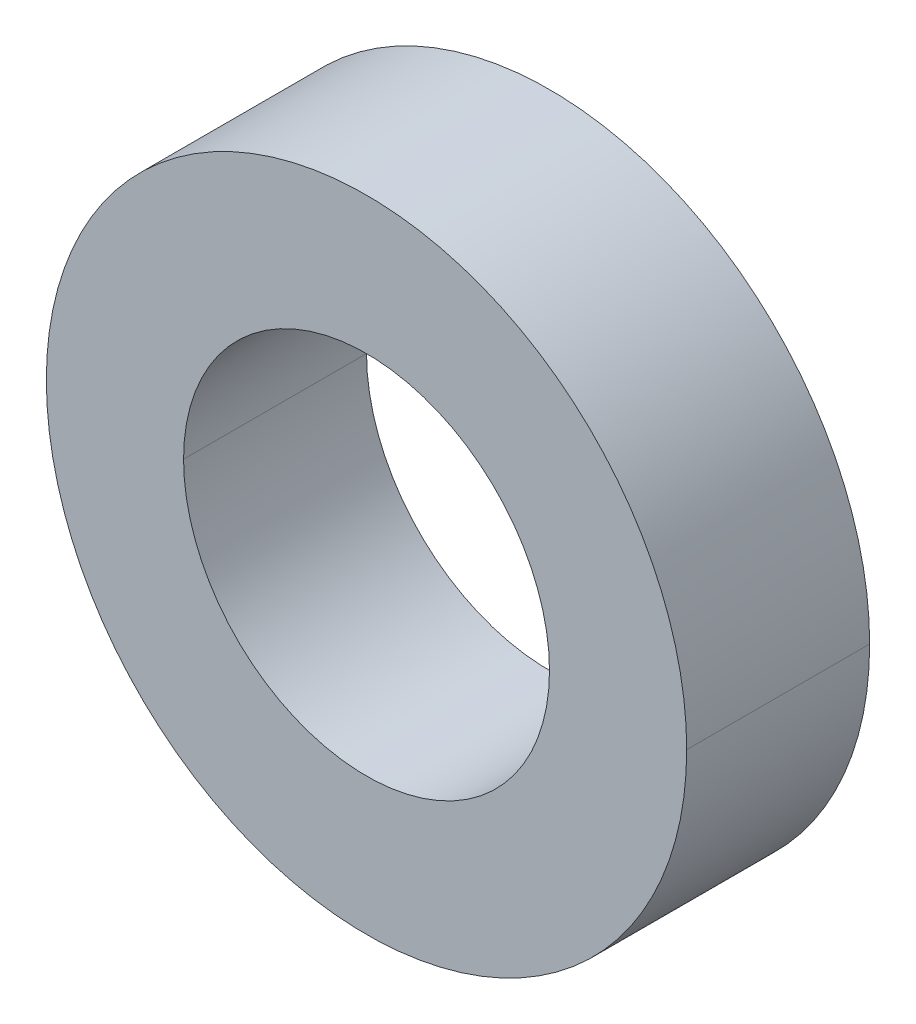
ISO-10303-21;
HEADER;
FILE_DESCRIPTION(('STEP AP214'),'2;1');
FILE_NAME('part.step','',(''),(''),'','','');
FILE_SCHEMA(('AUTOMOTIVE_DESIGN { 1 0 10303 214 1 1 1 1 }'));
ENDSEC;
DATA;
#1=APPLICATION_CONTEXT('core data for automotive mechanical design processes');
#2=APPLICATION_PROTOCOL_DEFINITION('international standard','automotive_design',2000,#1);
#3=PRODUCT_CONTEXT('',#1,'mechanical');
#4=PRODUCT('Part','Part','',(#3));
#5=PRODUCT_RELATED_PRODUCT_CATEGORY('part','',(#4));
#6=PRODUCT_DEFINITION_FORMATION('','',#4);
#7=PRODUCT_DEFINITION_CONTEXT('part definition',#1,'design');
#8=PRODUCT_DEFINITION('design','',#6,#7);
#9=PRODUCT_DEFINITION_SHAPE('','',#8);
#10=(LENGTH_UNIT() NAMED_UNIT(*) SI_UNIT(.MILLI.,.METRE.));
#11=(NAMED_UNIT(*) PLANE_ANGLE_UNIT() SI_UNIT($,.RADIAN.));
#12=(NAMED_UNIT(*) SI_UNIT($,.STERADIAN.) SOLID_ANGLE_UNIT());
#13=UNCERTAINTY_MEASURE_WITH_UNIT(LENGTH_MEASURE(1.E-05),#10,'distance_accuracy_value','');
#14=(GEOMETRIC_REPRESENTATION_CONTEXT(3) GLOBAL_UNCERTAINTY_ASSIGNED_CONTEXT((#13)) GLOBAL_UNIT_ASSIGNED_CONTEXT((#10,
#11,#12)) REPRESENTATION_CONTEXT('',''));
#15=CARTESIAN_POINT('',(0.,0.,0.));
#16=DIRECTION('',(0.,0.,1.));
#17=DIRECTION('',(1.,0.,0.));
#18=AXIS2_PLACEMENT_3D('',#15,#16,#17);
#19=CARTESIAN_POINT('',(0.403421843265389,-40.0666634220304,10.));
#20=DIRECTION('',(0.,0.,-1.));
#21=DIRECTION('',(-1.,0.,0.));
#22=AXIS2_PLACEMENT_3D('',#19,#20,#21);
#23=CYLINDRICAL_SURFACE('',#22,10.);
#24=DIRECTION('',(0.,0.,-1.));
#25=VECTOR('',#24,1.);
#26=CARTESIAN_POINT('',(10.4034218432654,-40.0666634220304,10.));
#27=LINE('',#26,#25);
#28=CARTESIAN_POINT('',(10.4034218432654,-40.0666634220304,10.));
#29=VERTEX_POINT('',#28);
#30=CARTESIAN_POINT('',(10.4034218432654,-40.0666634220304,0.));
#31=VERTEX_POINT('',#30);
#32=EDGE_CURVE('E75',#29,#31,#27,.T.);
#33=ORIENTED_EDGE('',*,*,#32,.F.);
#34=CARTESIAN_POINT('',(0.403421843265389,-40.0666634220304,10.));
#35=DIRECTION('',(0.,0.,1.));
#36=DIRECTION('',(1.,0.,0.));
#37=AXIS2_PLACEMENT_3D('',#34,#35,#36);
#38=CIRCLE('',#37,10.);
#39=CARTESIAN_POINT('',(-9.59657815673461,-40.0666634220304,10.));
#40=VERTEX_POINT('',#39);
#41=EDGE_CURVE('E64',#29,#40,#38,.T.);
#42=ORIENTED_EDGE('',*,*,#41,.T.);
#43=DIRECTION('',(0.,0.,-1.));
#44=VECTOR('',#43,1.);
#45=CARTESIAN_POINT('',(-9.59657815673461,-40.0666634220304,10.));
#46=LINE('',#45,#44);
#47=CARTESIAN_POINT('',(-9.59657815673461,-40.0666634220304,0.));
#48=VERTEX_POINT('',#47);
#49=EDGE_CURVE('E72',#40,#48,#46,.T.);
#50=ORIENTED_EDGE('',*,*,#49,.T.);
#51=CARTESIAN_POINT('',(0.403421843265389,-40.0666634220304,0.));
#52=DIRECTION('',(0.,0.,1.));
#53=DIRECTION('',(1.,0.,0.));
#54=AXIS2_PLACEMENT_3D('',#51,#52,#53);
#55=CIRCLE('',#54,10.);
#56=EDGE_CURVE('E11',#31,#48,#55,.T.);
#57=ORIENTED_EDGE('',*,*,#56,.F.);
#58=EDGE_LOOP('',(#33,#42,#50,#57));
#59=FACE_BOUND('',#58,.T.);
#60=ADVANCED_FACE('F17',(#59),#23,.F.);
#61=CARTESIAN_POINT('',(0.403421843265389,-40.0666634220304,10.));
#62=DIRECTION('',(0.,0.,-1.));
#63=DIRECTION('',(-1.,0.,0.));
#64=AXIS2_PLACEMENT_3D('',#61,#62,#63);
#65=CYLINDRICAL_SURFACE('',#64,17.5);
#66=DIRECTION('',(0.,0.,-1.));
#67=VECTOR('',#66,1.);
#68=CARTESIAN_POINT('',(17.9034218432654,-40.0666634220304,10.));
#69=LINE('',#68,#67);
#70=CARTESIAN_POINT('',(17.9034218432654,-40.0666634220304,10.));
#71=VERTEX_POINT('',#70);
#72=CARTESIAN_POINT('',(17.9034218432654,-40.0666634220304,0.));
#73=VERTEX_POINT('',#72);
#74=EDGE_CURVE('E105',#71,#73,#69,.T.);
#75=ORIENTED_EDGE('',*,*,#74,.F.);
#76=CARTESIAN_POINT('',(0.403421843265389,-40.0666634220304,10.));
#77=DIRECTION('',(0.,0.,1.));
#78=DIRECTION('',(1.,0.,0.));
#79=AXIS2_PLACEMENT_3D('',#76,#77,#78);
#80=CIRCLE('',#79,17.5);
#81=CARTESIAN_POINT('',(-17.0965781567346,-40.0666634220304,10.));
#82=VERTEX_POINT('',#81);
#83=EDGE_CURVE('E78',#82,#71,#80,.T.);
#84=ORIENTED_EDGE('',*,*,#83,.F.);
#85=DIRECTION('',(0.,0.,-1.));
#86=VECTOR('',#85,1.);
#87=CARTESIAN_POINT('',(-17.0965781567346,-40.0666634220304,10.));
#88=LINE('',#87,#86);
#89=CARTESIAN_POINT('',(-17.0965781567346,-40.0666634220304,0.));
#90=VERTEX_POINT('',#89);
#91=EDGE_CURVE('E100',#82,#90,#88,.T.);
#92=ORIENTED_EDGE('',*,*,#91,.T.);
#93=CARTESIAN_POINT('',(0.403421843265389,-40.0666634220304,0.));
#94=DIRECTION('',(0.,0.,1.));
#95=DIRECTION('',(1.,0.,0.));
#96=AXIS2_PLACEMENT_3D('',#93,#94,#95);
#97=CIRCLE('',#96,17.5);
#98=EDGE_CURVE('E27',#90,#73,#97,.T.);
#99=ORIENTED_EDGE('',*,*,#98,.T.);
#100=EDGE_LOOP('',(#75,#84,#92,#99));
#101=FACE_BOUND('',#100,.T.);
#102=ADVANCED_FACE('F119',(#101),#65,.T.);
#103=CARTESIAN_POINT('',(0.403421843265389,-40.0666634220304,0.));
#104=DIRECTION('',(0.,0.,1.));
#105=DIRECTION('',(1.,0.,0.));
#106=AXIS2_PLACEMENT_3D('',#103,#104,#105);
#107=PLANE('',#106);
#108=CARTESIAN_POINT('',(0.403421843265389,-40.0666634220304,0.));
#109=DIRECTION('',(0.,0.,1.));
#110=DIRECTION('',(1.,0.,0.));
#111=AXIS2_PLACEMENT_3D('',#108,#109,#110);
#112=CIRCLE('',#111,10.);
#113=EDGE_CURVE('E84',#48,#31,#112,.T.);
#114=ORIENTED_EDGE('',*,*,#113,.T.);
#115=ORIENTED_EDGE('',*,*,#56,.T.);
#116=EDGE_LOOP('',(#114,#115));
#117=FACE_BOUND('',#116,.T.);
#118=ORIENTED_EDGE('',*,*,#98,.F.);
#119=CARTESIAN_POINT('',(0.403421843265389,-40.0666634220304,0.));
#120=DIRECTION('',(0.,0.,1.));
#121=DIRECTION('',(1.,0.,0.));
#122=AXIS2_PLACEMENT_3D('',#119,#120,#121);
#123=CIRCLE('',#122,17.5);
#124=EDGE_CURVE('E102',#73,#90,#123,.T.);
#125=ORIENTED_EDGE('',*,*,#124,.F.);
#126=EDGE_LOOP('',(#118,#125));
#127=FACE_BOUND('',#126,.T.);
#128=ADVANCED_FACE('F19',(#117,#127),#107,.F.);
#129=CARTESIAN_POINT('',(0.403421843265389,-40.0666634220304,10.));
#130=DIRECTION('',(0.,0.,1.));
#131=DIRECTION('',(1.,0.,0.));
#132=AXIS2_PLACEMENT_3D('',#129,#130,#131);
#133=PLANE('',#132);
#134=CARTESIAN_POINT('',(0.403421843265389,-40.0666634220304,10.));
#135=DIRECTION('',(0.,0.,1.));
#136=DIRECTION('',(1.,0.,0.));
#137=AXIS2_PLACEMENT_3D('',#134,#135,#136);
#138=CIRCLE('',#137,10.);
#139=EDGE_CURVE('E82',#40,#29,#138,.T.);
#140=ORIENTED_EDGE('',*,*,#139,.F.);
#141=ORIENTED_EDGE('',*,*,#41,.F.);
#142=EDGE_LOOP('',(#140,#141));
#143=FACE_BOUND('',#142,.T.);
#144=ORIENTED_EDGE('',*,*,#83,.T.);
#145=CARTESIAN_POINT('',(0.403421843265389,-40.0666634220304,10.));
#146=DIRECTION('',(0.,0.,1.));
#147=DIRECTION('',(1.,0.,0.));
#148=AXIS2_PLACEMENT_3D('',#145,#146,#147);
#149=CIRCLE('',#148,17.5);
#150=EDGE_CURVE('E86',#71,#82,#149,.T.);
#151=ORIENTED_EDGE('',*,*,#150,.T.);
#152=EDGE_LOOP('',(#144,#151));
#153=FACE_BOUND('',#152,.T.);
#154=ADVANCED_FACE('F88',(#143,#153),#133,.T.);
#155=CARTESIAN_POINT('',(0.403421843265389,-40.0666634220304,10.));
#156=DIRECTION('',(0.,0.,-1.));
#157=DIRECTION('',(-1.,0.,0.));
#158=AXIS2_PLACEMENT_3D('',#155,#156,#157);
#159=CYLINDRICAL_SURFACE('',#158,17.5);
#160=ORIENTED_EDGE('',*,*,#150,.F.);
#161=ORIENTED_EDGE('',*,*,#74,.T.);
#162=ORIENTED_EDGE('',*,*,#124,.T.);
#163=ORIENTED_EDGE('',*,*,#91,.F.);
#164=EDGE_LOOP('',(#160,#161,#162,#163));
#165=FACE_BOUND('',#164,.T.);
#166=ADVANCED_FACE('F123',(#165),#159,.T.);
#167=CARTESIAN_POINT('',(0.403421843265389,-40.0666634220304,10.));
#168=DIRECTION('',(0.,0.,-1.));
#169=DIRECTION('',(-1.,0.,0.));
#170=AXIS2_PLACEMENT_3D('',#167,#168,#169);
#171=CYLINDRICAL_SURFACE('',#170,10.);
#172=ORIENTED_EDGE('',*,*,#139,.T.);
#173=ORIENTED_EDGE('',*,*,#32,.T.);
#174=ORIENTED_EDGE('',*,*,#113,.F.);
#175=ORIENTED_EDGE('',*,*,#49,.F.);
#176=EDGE_LOOP('',(#172,#173,#174,#175));
#177=FACE_BOUND('',#176,.T.);
#178=ADVANCED_FACE('F81',(#177),#171,.F.);
#179=CLOSED_SHELL('',(#60,#102,#128,#154,#166,#178));
#180=MANIFOLD_SOLID_BREP('B1',#179);
#181=ADVANCED_BREP_SHAPE_REPRESENTATION('',(#18,#180),#14);
#182=SHAPE_DEFINITION_REPRESENTATION(#9,#181);
ENDSEC;
END-ISO-10303-21;
